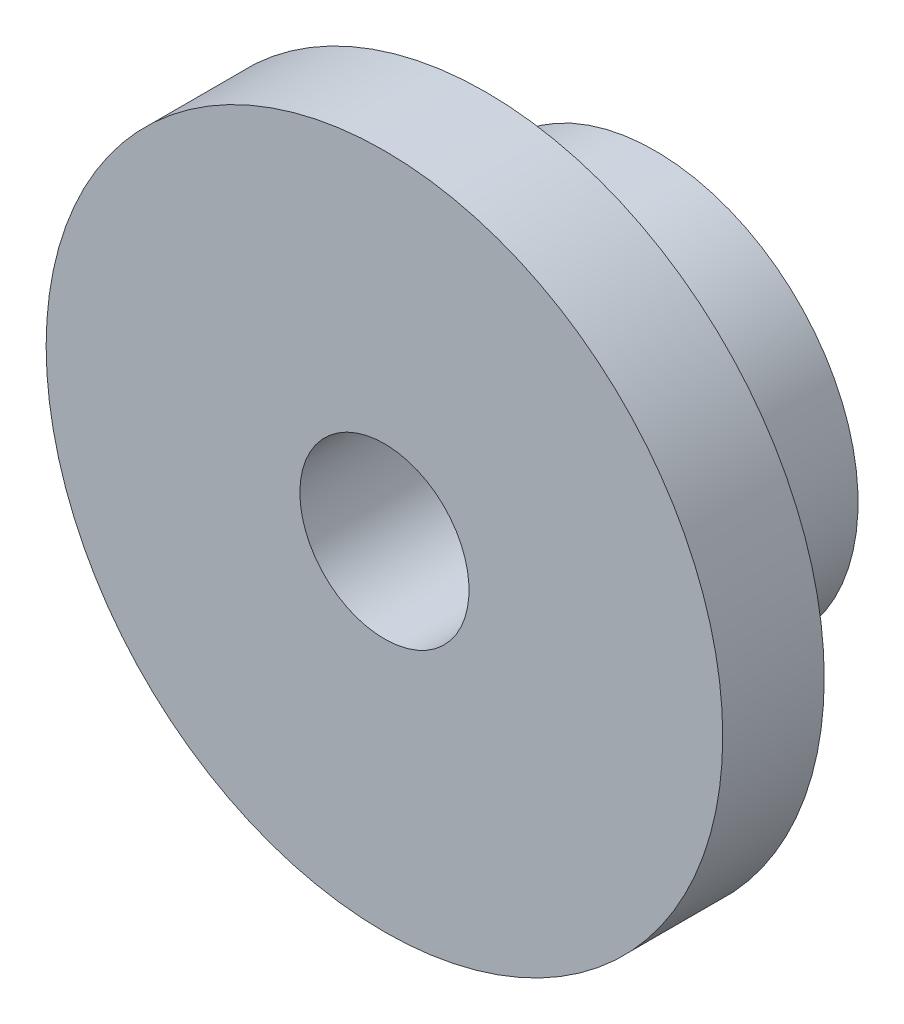
ISO-10303-21;
HEADER;
FILE_DESCRIPTION(('STEP AP214'),'2;1');
FILE_NAME('part.step','',(''),(''),'','','');
FILE_SCHEMA(('AUTOMOTIVE_DESIGN { 1 0 10303 214 1 1 1 1 }'));
ENDSEC;
DATA;
#1=APPLICATION_CONTEXT('core data for automotive mechanical design processes');
#2=APPLICATION_PROTOCOL_DEFINITION('international standard','automotive_design',2000,#1);
#3=PRODUCT_CONTEXT('',#1,'mechanical');
#4=PRODUCT('Part','Part','',(#3));
#5=PRODUCT_RELATED_PRODUCT_CATEGORY('part','',(#4));
#6=PRODUCT_DEFINITION_FORMATION('','',#4);
#7=PRODUCT_DEFINITION_CONTEXT('part definition',#1,'design');
#8=PRODUCT_DEFINITION('design','',#6,#7);
#9=PRODUCT_DEFINITION_SHAPE('','',#8);
#10=(LENGTH_UNIT() NAMED_UNIT(*) SI_UNIT(.MILLI.,.METRE.));
#11=(NAMED_UNIT(*) PLANE_ANGLE_UNIT() SI_UNIT($,.RADIAN.));
#12=(NAMED_UNIT(*) SI_UNIT($,.STERADIAN.) SOLID_ANGLE_UNIT());
#13=UNCERTAINTY_MEASURE_WITH_UNIT(LENGTH_MEASURE(1.E-05),#10,'distance_accuracy_value','');
#14=(GEOMETRIC_REPRESENTATION_CONTEXT(3) GLOBAL_UNCERTAINTY_ASSIGNED_CONTEXT((#13)) GLOBAL_UNIT_ASSIGNED_CONTEXT((#10,
#11,#12)) REPRESENTATION_CONTEXT('',''));
#15=CARTESIAN_POINT('',(0.,0.,0.));
#16=DIRECTION('',(0.,0.,1.));
#17=DIRECTION('',(1.,0.,0.));
#18=AXIS2_PLACEMENT_3D('',#15,#16,#17);
#19=CARTESIAN_POINT('',(0.,0.,3.));
#20=DIRECTION('',(0.,0.,-1.));
#21=DIRECTION('',(-1.,0.,0.));
#22=AXIS2_PLACEMENT_3D('',#19,#20,#21);
#23=CYLINDRICAL_SURFACE('',#22,10.);
#24=CARTESIAN_POINT('',(0.,0.,3.));
#25=DIRECTION('',(0.,0.,1.));
#26=DIRECTION('',(1.,0.,0.));
#27=AXIS2_PLACEMENT_3D('',#24,#25,#26);
#28=CIRCLE('',#27,10.);
#29=CARTESIAN_POINT('',(10.,0.,3.));
#30=VERTEX_POINT('',#29);
#31=EDGE_CURVE('E45',#30,#30,#28,.T.);
#32=ORIENTED_EDGE('',*,*,#31,.F.);
#33=EDGE_LOOP('',(#32));
#34=FACE_BOUND('',#33,.T.);
#35=CARTESIAN_POINT('',(0.,0.,0.));
#36=DIRECTION('',(0.,0.,1.));
#37=DIRECTION('',(1.,0.,0.));
#38=AXIS2_PLACEMENT_3D('',#35,#36,#37);
#39=CIRCLE('',#38,10.);
#40=CARTESIAN_POINT('',(10.,0.,0.));
#41=VERTEX_POINT('',#40);
#42=EDGE_CURVE('E40',#41,#41,#39,.T.);
#43=ORIENTED_EDGE('',*,*,#42,.T.);
#44=EDGE_LOOP('',(#43));
#45=FACE_BOUND('',#44,.T.);
#46=ADVANCED_FACE('F37',(#34,#45),#23,.T.);
#47=CARTESIAN_POINT('',(0.,0.,3.));
#48=DIRECTION('',(0.,0.,1.));
#49=DIRECTION('',(1.,0.,0.));
#50=AXIS2_PLACEMENT_3D('',#47,#48,#49);
#51=PLANE('',#50);
#52=CARTESIAN_POINT('',(0.,0.,3.));
#53=DIRECTION('',(0.,0.,-1.));
#54=DIRECTION('',(-1.,0.,0.));
#55=AXIS2_PLACEMENT_3D('',#52,#53,#54);
#56=CIRCLE('',#55,2.5);
#57=CARTESIAN_POINT('',(-2.5,0.,3.));
#58=VERTEX_POINT('',#57);
#59=EDGE_CURVE('E56',#58,#58,#56,.T.);
#60=ORIENTED_EDGE('',*,*,#59,.T.);
#61=EDGE_LOOP('',(#60));
#62=FACE_BOUND('',#61,.T.);
#63=ORIENTED_EDGE('',*,*,#31,.T.);
#64=EDGE_LOOP('',(#63));
#65=FACE_BOUND('',#64,.T.);
#66=ADVANCED_FACE('F80',(#62,#65),#51,.T.);
#67=CARTESIAN_POINT('',(0.,0.,0.));
#68=DIRECTION('',(0.,0.,1.));
#69=DIRECTION('',(1.,0.,0.));
#70=AXIS2_PLACEMENT_3D('',#67,#68,#69);
#71=PLANE('',#70);
#72=CARTESIAN_POINT('',(0.,0.,0.));
#73=DIRECTION('',(0.,0.,-1.));
#74=DIRECTION('',(-1.,0.,0.));
#75=AXIS2_PLACEMENT_3D('',#72,#73,#74);
#76=CIRCLE('',#75,6.);
#77=CARTESIAN_POINT('',(-6.,0.,0.));
#78=VERTEX_POINT('',#77);
#79=EDGE_CURVE('E10',#78,#78,#76,.T.);
#80=ORIENTED_EDGE('',*,*,#79,.F.);
#81=EDGE_LOOP('',(#80));
#82=FACE_BOUND('',#81,.T.);
#83=ORIENTED_EDGE('',*,*,#42,.F.);
#84=EDGE_LOOP('',(#83));
#85=FACE_BOUND('',#84,.T.);
#86=ADVANCED_FACE('F75',(#82,#85),#71,.F.);
#87=CARTESIAN_POINT('',(0.,0.,-5.));
#88=DIRECTION('',(0.,0.,1.));
#89=DIRECTION('',(1.,0.,0.));
#90=AXIS2_PLACEMENT_3D('',#87,#88,#89);
#91=CYLINDRICAL_SURFACE('',#90,6.);
#92=CARTESIAN_POINT('',(0.,0.,-5.));
#93=DIRECTION('',(0.,0.,-1.));
#94=DIRECTION('',(-1.,0.,0.));
#95=AXIS2_PLACEMENT_3D('',#92,#93,#94);
#96=CIRCLE('',#95,6.);
#97=CARTESIAN_POINT('',(-6.,0.,-5.));
#98=VERTEX_POINT('',#97);
#99=EDGE_CURVE('E52',#98,#98,#96,.T.);
#100=ORIENTED_EDGE('',*,*,#99,.F.);
#101=EDGE_LOOP('',(#100));
#102=FACE_BOUND('',#101,.T.);
#103=ORIENTED_EDGE('',*,*,#79,.T.);
#104=EDGE_LOOP('',(#103));
#105=FACE_BOUND('',#104,.T.);
#106=ADVANCED_FACE('F70',(#102,#105),#91,.T.);
#107=CARTESIAN_POINT('',(0.,0.,-5.));
#108=DIRECTION('',(0.,0.,-1.));
#109=DIRECTION('',(-1.,0.,0.));
#110=AXIS2_PLACEMENT_3D('',#107,#108,#109);
#111=PLANE('',#110);
#112=CARTESIAN_POINT('',(0.,0.,-5.));
#113=DIRECTION('',(0.,0.,-1.));
#114=DIRECTION('',(-1.,0.,0.));
#115=AXIS2_PLACEMENT_3D('',#112,#113,#114);
#116=CIRCLE('',#115,2.49999999999999);
#117=CARTESIAN_POINT('',(-2.49999999999999,0.,-5.));
#118=VERTEX_POINT('',#117);
#119=EDGE_CURVE('E60',#118,#118,#116,.T.);
#120=ORIENTED_EDGE('',*,*,#119,.F.);
#121=EDGE_LOOP('',(#120));
#122=FACE_BOUND('',#121,.T.);
#123=ORIENTED_EDGE('',*,*,#99,.T.);
#124=EDGE_LOOP('',(#123));
#125=FACE_BOUND('',#124,.T.);
#126=ADVANCED_FACE('F67',(#122,#125),#111,.T.);
#127=CARTESIAN_POINT('',(0.,0.,-5.));
#128=DIRECTION('',(0.,0.,-1.));
#129=DIRECTION('',(-1.,0.,0.));
#130=AXIS2_PLACEMENT_3D('',#127,#128,#129);
#131=CYLINDRICAL_SURFACE('',#130,2.49999999999999);
#132=ORIENTED_EDGE('',*,*,#59,.F.);
#133=EDGE_LOOP('',(#132));
#134=FACE_BOUND('',#133,.T.);
#135=ORIENTED_EDGE('',*,*,#119,.T.);
#136=EDGE_LOOP('',(#135));
#137=FACE_BOUND('',#136,.T.);
#138=ADVANCED_FACE('F65',(#134,#137),#131,.F.);
#139=CLOSED_SHELL('',(#46,#66,#86,#106,#126,#138));
#140=MANIFOLD_SOLID_BREP('B2',#139);
#141=ADVANCED_BREP_SHAPE_REPRESENTATION('',(#18,#140),#14);
#142=SHAPE_DEFINITION_REPRESENTATION(#9,#141);
ENDSEC;
END-ISO-10303-21;
